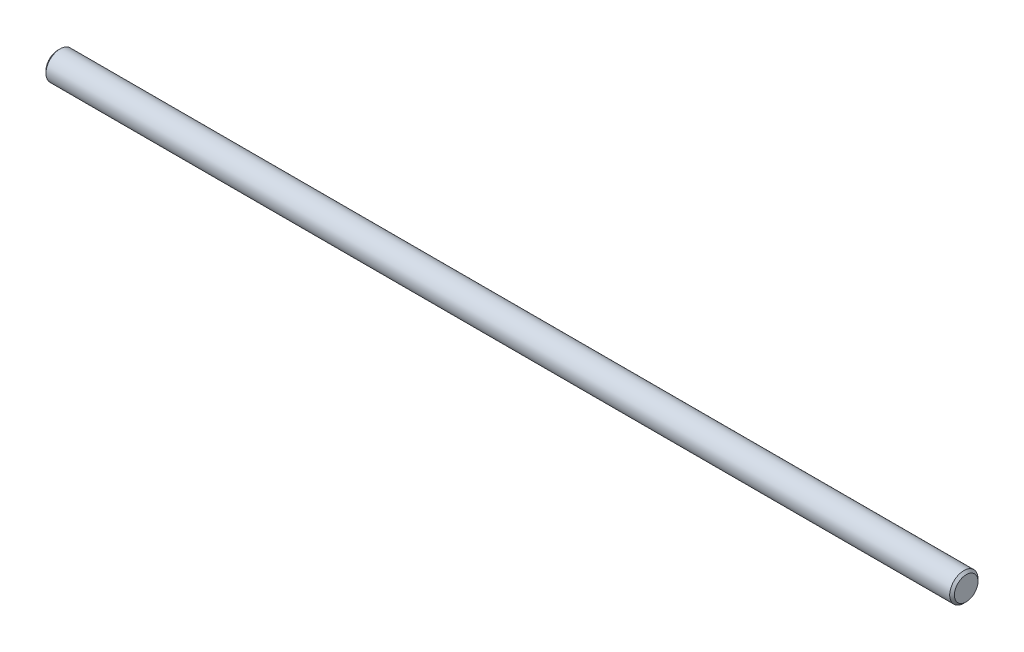
ISO-10303-21;
HEADER;
FILE_DESCRIPTION(('STEP AP214'),'2;1');
FILE_NAME('part.step','',(''),(''),'','','');
FILE_SCHEMA(('AUTOMOTIVE_DESIGN { 1 0 10303 214 1 1 1 1 }'));
ENDSEC;
DATA;
#1=APPLICATION_CONTEXT('core data for automotive mechanical design processes');
#2=APPLICATION_PROTOCOL_DEFINITION('international standard','automotive_design',2000,#1);
#3=PRODUCT_CONTEXT('',#1,'mechanical');
#4=PRODUCT('Part','Part','',(#3));
#5=PRODUCT_RELATED_PRODUCT_CATEGORY('part','',(#4));
#6=PRODUCT_DEFINITION_FORMATION('','',#4);
#7=PRODUCT_DEFINITION_CONTEXT('part definition',#1,'design');
#8=PRODUCT_DEFINITION('design','',#6,#7);
#9=PRODUCT_DEFINITION_SHAPE('','',#8);
#10=(LENGTH_UNIT() NAMED_UNIT(*) SI_UNIT(.MILLI.,.METRE.));
#11=(NAMED_UNIT(*) PLANE_ANGLE_UNIT() SI_UNIT($,.RADIAN.));
#12=(NAMED_UNIT(*) SI_UNIT($,.STERADIAN.) SOLID_ANGLE_UNIT());
#13=UNCERTAINTY_MEASURE_WITH_UNIT(LENGTH_MEASURE(1.E-05),#10,'distance_accuracy_value','');
#14=(GEOMETRIC_REPRESENTATION_CONTEXT(3) GLOBAL_UNCERTAINTY_ASSIGNED_CONTEXT((#13)) GLOBAL_UNIT_ASSIGNED_CONTEXT((#10,
#11,#12)) REPRESENTATION_CONTEXT('',''));
#15=CARTESIAN_POINT('',(0.,0.,0.));
#16=DIRECTION('',(0.,0.,1.));
#17=DIRECTION('',(1.,0.,0.));
#18=AXIS2_PLACEMENT_3D('',#15,#16,#17);
#19=CARTESIAN_POINT('',(192.5,0.,0.));
#20=DIRECTION('',(-1.,0.,0.));
#21=DIRECTION('',(0.,0.,1.));
#22=AXIS2_PLACEMENT_3D('',#19,#20,#21);
#23=CYLINDRICAL_SURFACE('',#22,6.);
#24=CARTESIAN_POINT('',(191.5,0.,0.));
#25=DIRECTION('',(1.,0.,0.));
#26=DIRECTION('',(0.,0.,-1.));
#27=AXIS2_PLACEMENT_3D('',#24,#25,#26);
#28=CIRCLE('',#27,6.);
#29=CARTESIAN_POINT('',(191.5,0.,-6.));
#30=VERTEX_POINT('',#29);
#31=EDGE_CURVE('E38',#30,#30,#28,.F.);
#32=ORIENTED_EDGE('',*,*,#31,.T.);
#33=EDGE_LOOP('',(#32));
#34=FACE_BOUND('',#33,.T.);
#35=CARTESIAN_POINT('',(-191.5,0.,0.));
#36=DIRECTION('',(1.,0.,0.));
#37=DIRECTION('',(0.,0.,-1.));
#38=AXIS2_PLACEMENT_3D('',#35,#36,#37);
#39=CIRCLE('',#38,6.);
#40=CARTESIAN_POINT('',(-191.5,0.,-6.));
#41=VERTEX_POINT('',#40);
#42=EDGE_CURVE('E42',#41,#41,#39,.T.);
#43=ORIENTED_EDGE('',*,*,#42,.T.);
#44=EDGE_LOOP('',(#43));
#45=FACE_BOUND('',#44,.T.);
#46=ADVANCED_FACE('F31',(#34,#45),#23,.T.);
#47=CARTESIAN_POINT('',(192.5,0.,0.));
#48=DIRECTION('',(1.,0.,0.));
#49=DIRECTION('',(0.,0.,-1.));
#50=AXIS2_PLACEMENT_3D('',#47,#48,#49);
#51=PLANE('',#50);
#52=CARTESIAN_POINT('',(192.5,0.,0.));
#53=DIRECTION('',(1.,0.,0.));
#54=DIRECTION('',(0.,0.,-1.));
#55=AXIS2_PLACEMENT_3D('',#52,#53,#54);
#56=CIRCLE('',#55,5.);
#57=CARTESIAN_POINT('',(192.5,0.,-5.));
#58=VERTEX_POINT('',#57);
#59=EDGE_CURVE('E46',#58,#58,#56,.T.);
#60=ORIENTED_EDGE('',*,*,#59,.T.);
#61=EDGE_LOOP('',(#60));
#62=FACE_BOUND('',#61,.T.);
#63=ADVANCED_FACE('F52',(#62),#51,.T.);
#64=CARTESIAN_POINT('',(-192.5,0.,0.));
#65=DIRECTION('',(1.,0.,0.));
#66=DIRECTION('',(0.,0.,-1.));
#67=AXIS2_PLACEMENT_3D('',#64,#65,#66);
#68=PLANE('',#67);
#69=CARTESIAN_POINT('',(-192.5,0.,0.));
#70=DIRECTION('',(1.,0.,0.));
#71=DIRECTION('',(0.,0.,-1.));
#72=AXIS2_PLACEMENT_3D('',#69,#70,#71);
#73=CIRCLE('',#72,4.99999999999989);
#74=CARTESIAN_POINT('',(-192.5,0.,-4.99999999999989));
#75=VERTEX_POINT('',#74);
#76=EDGE_CURVE('E10',#75,#75,#73,.F.);
#77=ORIENTED_EDGE('',*,*,#76,.T.);
#78=EDGE_LOOP('',(#77));
#79=FACE_BOUND('',#78,.T.);
#80=ADVANCED_FACE('F56',(#79),#68,.F.);
#81=CARTESIAN_POINT('',(192.5,0.,0.));
#82=DIRECTION('',(-1.,0.,0.));
#83=DIRECTION('',(0.,0.,1.));
#84=AXIS2_PLACEMENT_3D('',#81,#82,#83);
#85=CONICAL_SURFACE('',#84,5.,0.785398163397432);
#86=ORIENTED_EDGE('',*,*,#31,.F.);
#87=EDGE_LOOP('',(#86));
#88=FACE_BOUND('',#87,.T.);
#89=ORIENTED_EDGE('',*,*,#59,.F.);
#90=EDGE_LOOP('',(#89));
#91=FACE_BOUND('',#90,.T.);
#92=ADVANCED_FACE('F54',(#88,#91),#85,.T.);
#93=CARTESIAN_POINT('',(-191.5,0.,0.));
#94=DIRECTION('',(1.,0.,0.));
#95=DIRECTION('',(0.,0.,-1.));
#96=AXIS2_PLACEMENT_3D('',#93,#94,#95);
#97=CONICAL_SURFACE('',#96,6.,0.785398163397446);
#98=ORIENTED_EDGE('',*,*,#76,.F.);
#99=EDGE_LOOP('',(#98));
#100=FACE_BOUND('',#99,.T.);
#101=ORIENTED_EDGE('',*,*,#42,.F.);
#102=EDGE_LOOP('',(#101));
#103=FACE_BOUND('',#102,.T.);
#104=ADVANCED_FACE('F33',(#100,#103),#97,.T.);
#105=CLOSED_SHELL('',(#46,#63,#80,#92,#104));
#106=MANIFOLD_SOLID_BREP('B2',#105);
#107=ADVANCED_BREP_SHAPE_REPRESENTATION('',(#18,#106),#14);
#108=SHAPE_DEFINITION_REPRESENTATION(#9,#107);
ENDSEC;
END-ISO-10303-21;
